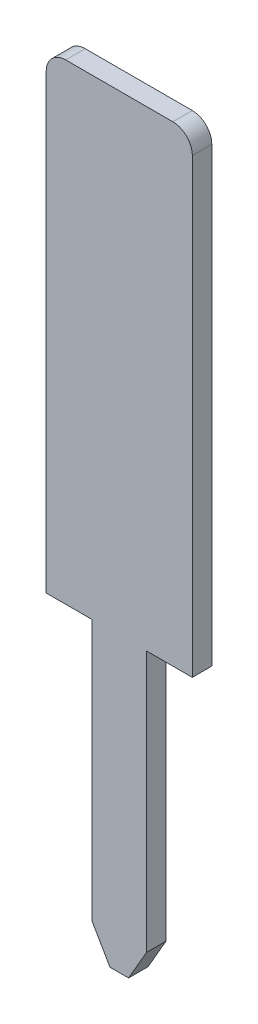
ISO-10303-21;
HEADER;
FILE_DESCRIPTION(('STEP AP214'),'2;1');
FILE_NAME('part.step','',(''),(''),'','','');
FILE_SCHEMA(('AUTOMOTIVE_DESIGN { 1 0 10303 214 1 1 1 1 }'));
ENDSEC;
DATA;
#1=APPLICATION_CONTEXT('core data for automotive mechanical design processes');
#2=APPLICATION_PROTOCOL_DEFINITION('international standard','automotive_design',2000,#1);
#3=PRODUCT_CONTEXT('',#1,'mechanical');
#4=PRODUCT('Part','Part','',(#3));
#5=PRODUCT_RELATED_PRODUCT_CATEGORY('part','',(#4));
#6=PRODUCT_DEFINITION_FORMATION('','',#4);
#7=PRODUCT_DEFINITION_CONTEXT('part definition',#1,'design');
#8=PRODUCT_DEFINITION('design','',#6,#7);
#9=PRODUCT_DEFINITION_SHAPE('','',#8);
#10=(LENGTH_UNIT() NAMED_UNIT(*) SI_UNIT(.MILLI.,.METRE.));
#11=(NAMED_UNIT(*) PLANE_ANGLE_UNIT() SI_UNIT($,.RADIAN.));
#12=(NAMED_UNIT(*) SI_UNIT($,.STERADIAN.) SOLID_ANGLE_UNIT());
#13=UNCERTAINTY_MEASURE_WITH_UNIT(LENGTH_MEASURE(1.E-05),#10,'distance_accuracy_value','');
#14=(GEOMETRIC_REPRESENTATION_CONTEXT(3) GLOBAL_UNCERTAINTY_ASSIGNED_CONTEXT((#13)) GLOBAL_UNIT_ASSIGNED_CONTEXT((#10,
#11,#12)) REPRESENTATION_CONTEXT('',''));
#15=CARTESIAN_POINT('',(0.,0.,0.));
#16=DIRECTION('',(0.,0.,1.));
#17=DIRECTION('',(1.,0.,0.));
#18=AXIS2_PLACEMENT_3D('',#15,#16,#17);
#19=CARTESIAN_POINT('',(-49.1053468890321,-48.13344814412,0.254));
#20=DIRECTION('',(1.,0.,0.));
#21=DIRECTION('',(0.,0.,-1.));
#22=AXIS2_PLACEMENT_3D('',#19,#20,#21);
#23=PLANE('',#22);
#24=DIRECTION('',(0.,-1.,0.));
#25=VECTOR('',#24,1.);
#26=CARTESIAN_POINT('',(-49.1053468890321,-48.13344814412,0.254));
#27=LINE('',#26,#25);
#28=CARTESIAN_POINT('',(-49.1053468890321,-48.38744814412,0.254));
#29=VERTEX_POINT('',#28);
#30=CARTESIAN_POINT('',(-49.1053468890321,-54.28024814412,0.254));
#31=VERTEX_POINT('',#30);
#32=EDGE_CURVE('E123',#29,#31,#27,.T.);
#33=ORIENTED_EDGE('',*,*,#32,.F.);
#34=DIRECTION('',(0.,0.,-1.));
#35=VECTOR('',#34,1.);
#36=CARTESIAN_POINT('',(-49.1053468890321,-48.38744814412,0.254));
#37=LINE('',#36,#35);
#38=CARTESIAN_POINT('',(-49.1053468890321,-48.38744814412,0.));
#39=VERTEX_POINT('',#38);
#40=EDGE_CURVE('E147',#29,#39,#37,.T.);
#41=ORIENTED_EDGE('',*,*,#40,.T.);
#42=DIRECTION('',(0.,-1.,0.));
#43=VECTOR('',#42,1.);
#44=CARTESIAN_POINT('',(-49.1053468890321,-48.13344814412,0.));
#45=LINE('',#44,#43);
#46=CARTESIAN_POINT('',(-49.1053468890321,-54.28024814412,0.));
#47=VERTEX_POINT('',#46);
#48=EDGE_CURVE('E145',#39,#47,#45,.T.);
#49=ORIENTED_EDGE('',*,*,#48,.T.);
#50=DIRECTION('',(0.,0.,-1.));
#51=VECTOR('',#50,1.);
#52=CARTESIAN_POINT('',(-49.1053468890321,-54.28024814412,0.254));
#53=LINE('',#52,#51);
#54=EDGE_CURVE('E138',#31,#47,#53,.T.);
#55=ORIENTED_EDGE('',*,*,#54,.F.);
#56=EDGE_LOOP('',(#33,#41,#49,#55));
#57=FACE_BOUND('',#56,.T.);
#58=ADVANCED_FACE('F33',(#57),#23,.F.);
#59=CARTESIAN_POINT('',(-48.5084468890321,-54.28024814412,0.254));
#60=DIRECTION('',(0.,1.,0.));
#61=DIRECTION('',(0.,0.,1.));
#62=AXIS2_PLACEMENT_3D('',#59,#60,#61);
#63=PLANE('',#62);
#64=DIRECTION('',(1.,0.,0.));
#65=VECTOR('',#64,1.);
#66=CARTESIAN_POINT('',(-48.5084468890321,-54.28024814412,0.));
#67=LINE('',#66,#65);
#68=CARTESIAN_POINT('',(-48.5084468890321,-54.28024814412,0.));
#69=VERTEX_POINT('',#68);
#70=EDGE_CURVE('E217',#47,#69,#67,.T.);
#71=ORIENTED_EDGE('',*,*,#70,.T.);
#72=DIRECTION('',(0.,0.,-1.));
#73=VECTOR('',#72,1.);
#74=CARTESIAN_POINT('',(-48.5084468890321,-54.28024814412,0.254));
#75=LINE('',#74,#73);
#76=CARTESIAN_POINT('',(-48.5084468890321,-54.28024814412,0.254));
#77=VERTEX_POINT('',#76);
#78=EDGE_CURVE('E140',#77,#69,#75,.T.);
#79=ORIENTED_EDGE('',*,*,#78,.F.);
#80=DIRECTION('',(1.,0.,0.));
#81=VECTOR('',#80,1.);
#82=CARTESIAN_POINT('',(-48.5084468890321,-54.28024814412,0.254));
#83=LINE('',#82,#81);
#84=EDGE_CURVE('E126',#31,#77,#83,.T.);
#85=ORIENTED_EDGE('',*,*,#84,.F.);
#86=ORIENTED_EDGE('',*,*,#54,.T.);
#87=EDGE_LOOP('',(#71,#79,#85,#86));
#88=FACE_BOUND('',#87,.T.);
#89=ADVANCED_FACE('F137',(#88),#63,.F.);
#90=CARTESIAN_POINT('',(-48.5084468890321,-54.28024814412,0.254));
#91=DIRECTION('',(1.,0.,0.));
#92=DIRECTION('',(0.,0.,-1.));
#93=AXIS2_PLACEMENT_3D('',#90,#91,#92);
#94=PLANE('',#93);
#95=DIRECTION('',(0.,-1.,0.));
#96=VECTOR('',#95,1.);
#97=CARTESIAN_POINT('',(-48.5084468890321,-54.28024814412,0.));
#98=LINE('',#97,#96);
#99=CARTESIAN_POINT('',(-48.5084468890321,-57.6841938267253,0.));
#100=VERTEX_POINT('',#99);
#101=EDGE_CURVE('E211',#69,#100,#98,.T.);
#102=ORIENTED_EDGE('',*,*,#101,.T.);
#103=DIRECTION('',(0.,0.,-1.));
#104=VECTOR('',#103,1.);
#105=CARTESIAN_POINT('',(-48.5084468890321,-57.6841938267253,0.254));
#106=LINE('',#105,#104);
#107=CARTESIAN_POINT('',(-48.5084468890321,-57.6841938267253,0.254));
#108=VERTEX_POINT('',#107);
#109=EDGE_CURVE('E151',#108,#100,#106,.T.);
#110=ORIENTED_EDGE('',*,*,#109,.F.);
#111=DIRECTION('',(0.,-1.,0.));
#112=VECTOR('',#111,1.);
#113=CARTESIAN_POINT('',(-48.5084468890321,-54.28024814412,0.254));
#114=LINE('',#113,#112);
#115=EDGE_CURVE('E142',#77,#108,#114,.T.);
#116=ORIENTED_EDGE('',*,*,#115,.F.);
#117=ORIENTED_EDGE('',*,*,#78,.T.);
#118=EDGE_LOOP('',(#102,#110,#116,#117));
#119=FACE_BOUND('',#118,.T.);
#120=ADVANCED_FACE('F238',(#119),#94,.F.);
#121=CARTESIAN_POINT('',(-48.5084468890321,-57.6841938267253,0.254));
#122=DIRECTION('',(0.866025403784436,0.500000000000004,0.));
#123=DIRECTION('',(-0.500000000000004,0.866025403784436,0.));
#124=AXIS2_PLACEMENT_3D('',#121,#122,#123);
#125=PLANE('',#124);
#126=DIRECTION('',(0.500000000000004,-0.866025403784436,0.));
#127=VECTOR('',#126,1.);
#128=CARTESIAN_POINT('',(-48.5084468890321,-57.6841938267253,0.));
#129=LINE('',#128,#127);
#130=CARTESIAN_POINT('',(-48.2740113195786,-58.09024814412,0.));
#131=VERTEX_POINT('',#130);
#132=EDGE_CURVE('E206',#100,#131,#129,.T.);
#133=ORIENTED_EDGE('',*,*,#132,.T.);
#134=DIRECTION('',(0.,0.,-1.));
#135=VECTOR('',#134,1.);
#136=CARTESIAN_POINT('',(-48.2740113195786,-58.09024814412,0.254));
#137=LINE('',#136,#135);
#138=CARTESIAN_POINT('',(-48.2740113195786,-58.09024814412,0.254));
#139=VERTEX_POINT('',#138);
#140=EDGE_CURVE('E197',#139,#131,#137,.T.);
#141=ORIENTED_EDGE('',*,*,#140,.F.);
#142=DIRECTION('',(0.500000000000004,-0.866025403784436,0.));
#143=VECTOR('',#142,1.);
#144=CARTESIAN_POINT('',(-48.5084468890321,-57.6841938267253,0.254));
#145=LINE('',#144,#143);
#146=EDGE_CURVE('E207',#108,#139,#145,.T.);
#147=ORIENTED_EDGE('',*,*,#146,.F.);
#148=ORIENTED_EDGE('',*,*,#109,.T.);
#149=EDGE_LOOP('',(#133,#141,#147,#148));
#150=FACE_BOUND('',#149,.T.);
#151=ADVANCED_FACE('F204',(#150),#125,.F.);
#152=CARTESIAN_POINT('',(-48.2740113195786,-58.09024814412,0.254));
#153=DIRECTION('',(0.,1.,0.));
#154=DIRECTION('',(0.,0.,1.));
#155=AXIS2_PLACEMENT_3D('',#152,#153,#154);
#156=PLANE('',#155);
#157=DIRECTION('',(1.,0.,0.));
#158=VECTOR('',#157,1.);
#159=CARTESIAN_POINT('',(-48.2740113195786,-58.09024814412,0.));
#160=LINE('',#159,#158);
#161=CARTESIAN_POINT('',(-48.0316824584855,-58.09024814412,0.));
#162=VERTEX_POINT('',#161);
#163=EDGE_CURVE('E213',#131,#162,#160,.T.);
#164=ORIENTED_EDGE('',*,*,#163,.T.);
#165=DIRECTION('',(0.,0.,-1.));
#166=VECTOR('',#165,1.);
#167=CARTESIAN_POINT('',(-48.0316824584855,-58.09024814412,0.254));
#168=LINE('',#167,#166);
#169=CARTESIAN_POINT('',(-48.0316824584855,-58.09024814412,0.254));
#170=VERTEX_POINT('',#169);
#171=EDGE_CURVE('E194',#170,#162,#168,.T.);
#172=ORIENTED_EDGE('',*,*,#171,.F.);
#173=DIRECTION('',(1.,0.,0.));
#174=VECTOR('',#173,1.);
#175=CARTESIAN_POINT('',(-48.2740113195786,-58.09024814412,0.254));
#176=LINE('',#175,#174);
#177=EDGE_CURVE('E240',#139,#170,#176,.T.);
#178=ORIENTED_EDGE('',*,*,#177,.F.);
#179=ORIENTED_EDGE('',*,*,#140,.T.);
#180=EDGE_LOOP('',(#164,#172,#178,#179));
#181=FACE_BOUND('',#180,.T.);
#182=ADVANCED_FACE('F249',(#181),#156,.F.);
#183=CARTESIAN_POINT('',(-47.7972468890321,-57.6841938267253,0.254));
#184=DIRECTION('',(-0.86602540378443,0.500000000000015,0.));
#185=DIRECTION('',(-0.500000000000015,-0.86602540378443,0.));
#186=AXIS2_PLACEMENT_3D('',#183,#184,#185);
#187=PLANE('',#186);
#188=DIRECTION('',(0.500000000000015,0.86602540378443,0.));
#189=VECTOR('',#188,1.);
#190=CARTESIAN_POINT('',(-47.7972468890321,-57.6841938267253,0.));
#191=LINE('',#190,#189);
#192=CARTESIAN_POINT('',(-47.7972468890321,-57.6841938267253,0.));
#193=VERTEX_POINT('',#192);
#194=EDGE_CURVE('E215',#162,#193,#191,.T.);
#195=ORIENTED_EDGE('',*,*,#194,.T.);
#196=DIRECTION('',(0.,0.,-1.));
#197=VECTOR('',#196,1.);
#198=CARTESIAN_POINT('',(-47.7972468890321,-57.6841938267253,0.254));
#199=LINE('',#198,#197);
#200=CARTESIAN_POINT('',(-47.7972468890321,-57.6841938267253,0.254));
#201=VERTEX_POINT('',#200);
#202=EDGE_CURVE('E191',#201,#193,#199,.T.);
#203=ORIENTED_EDGE('',*,*,#202,.F.);
#204=DIRECTION('',(0.500000000000015,0.86602540378443,0.));
#205=VECTOR('',#204,1.);
#206=CARTESIAN_POINT('',(-47.7972468890321,-57.6841938267253,0.254));
#207=LINE('',#206,#205);
#208=EDGE_CURVE('E234',#170,#201,#207,.T.);
#209=ORIENTED_EDGE('',*,*,#208,.F.);
#210=ORIENTED_EDGE('',*,*,#171,.T.);
#211=EDGE_LOOP('',(#195,#203,#209,#210));
#212=FACE_BOUND('',#211,.T.);
#213=ADVANCED_FACE('F247',(#212),#187,.F.);
#214=CARTESIAN_POINT('',(-47.7972468890321,-54.28024814412,0.254));
#215=DIRECTION('',(-1.,0.,0.));
#216=DIRECTION('',(0.,-1.,0.));
#217=AXIS2_PLACEMENT_3D('',#214,#215,#216);
#218=PLANE('',#217);
#219=DIRECTION('',(0.,1.,0.));
#220=VECTOR('',#219,1.);
#221=CARTESIAN_POINT('',(-47.7972468890321,-54.28024814412,0.));
#222=LINE('',#221,#220);
#223=CARTESIAN_POINT('',(-47.7972468890321,-54.28024814412,0.));
#224=VERTEX_POINT('',#223);
#225=EDGE_CURVE('E183',#193,#224,#222,.T.);
#226=ORIENTED_EDGE('',*,*,#225,.T.);
#227=DIRECTION('',(0.,0.,-1.));
#228=VECTOR('',#227,1.);
#229=CARTESIAN_POINT('',(-47.7972468890321,-54.28024814412,0.254));
#230=LINE('',#229,#228);
#231=CARTESIAN_POINT('',(-47.7972468890321,-54.28024814412,0.254));
#232=VERTEX_POINT('',#231);
#233=EDGE_CURVE('E188',#232,#224,#230,.T.);
#234=ORIENTED_EDGE('',*,*,#233,.F.);
#235=DIRECTION('',(0.,1.,0.));
#236=VECTOR('',#235,1.);
#237=CARTESIAN_POINT('',(-47.7972468890321,-54.28024814412,0.254));
#238=LINE('',#237,#236);
#239=EDGE_CURVE('E231',#201,#232,#238,.T.);
#240=ORIENTED_EDGE('',*,*,#239,.F.);
#241=ORIENTED_EDGE('',*,*,#202,.T.);
#242=EDGE_LOOP('',(#226,#234,#240,#241));
#243=FACE_BOUND('',#242,.T.);
#244=ADVANCED_FACE('F224',(#243),#218,.F.);
#245=CARTESIAN_POINT('',(-47.7972468890321,-54.28024814412,0.254));
#246=DIRECTION('',(0.,1.,0.));
#247=DIRECTION('',(0.,0.,1.));
#248=AXIS2_PLACEMENT_3D('',#245,#246,#247);
#249=PLANE('',#248);
#250=DIRECTION('',(1.,0.,0.));
#251=VECTOR('',#250,1.);
#252=CARTESIAN_POINT('',(-47.7972468890321,-54.28024814412,0.));
#253=LINE('',#252,#251);
#254=CARTESIAN_POINT('',(-47.2003468890321,-54.28024814412,0.));
#255=VERTEX_POINT('',#254);
#256=EDGE_CURVE('E180',#224,#255,#253,.T.);
#257=ORIENTED_EDGE('',*,*,#256,.T.);
#258=DIRECTION('',(0.,0.,-1.));
#259=VECTOR('',#258,1.);
#260=CARTESIAN_POINT('',(-47.2003468890321,-54.28024814412,0.254));
#261=LINE('',#260,#259);
#262=CARTESIAN_POINT('',(-47.2003468890321,-54.28024814412,0.254));
#263=VERTEX_POINT('',#262);
#264=EDGE_CURVE('E170',#263,#255,#261,.T.);
#265=ORIENTED_EDGE('',*,*,#264,.F.);
#266=DIRECTION('',(1.,0.,0.));
#267=VECTOR('',#266,1.);
#268=CARTESIAN_POINT('',(-47.7972468890321,-54.28024814412,0.254));
#269=LINE('',#268,#267);
#270=EDGE_CURVE('E230',#232,#263,#269,.T.);
#271=ORIENTED_EDGE('',*,*,#270,.F.);
#272=ORIENTED_EDGE('',*,*,#233,.T.);
#273=EDGE_LOOP('',(#257,#265,#271,#272));
#274=FACE_BOUND('',#273,.T.);
#275=ADVANCED_FACE('F229',(#274),#249,.F.);
#276=CARTESIAN_POINT('',(-47.2003468890321,-54.28024814412,0.254));
#277=DIRECTION('',(-1.,0.,0.));
#278=DIRECTION('',(0.,-1.,0.));
#279=AXIS2_PLACEMENT_3D('',#276,#277,#278);
#280=PLANE('',#279);
#281=DIRECTION('',(0.,1.,0.));
#282=VECTOR('',#281,1.);
#283=CARTESIAN_POINT('',(-47.2003468890321,-54.28024814412,0.));
#284=LINE('',#283,#282);
#285=CARTESIAN_POINT('',(-47.2003468890321,-48.38744814412,0.));
#286=VERTEX_POINT('',#285);
#287=EDGE_CURVE('E176',#255,#286,#284,.T.);
#288=ORIENTED_EDGE('',*,*,#287,.T.);
#289=DIRECTION('',(0.,0.,-1.));
#290=VECTOR('',#289,1.);
#291=CARTESIAN_POINT('',(-47.2003468890321,-48.38744814412,0.254));
#292=LINE('',#291,#290);
#293=CARTESIAN_POINT('',(-47.2003468890321,-48.38744814412,0.254));
#294=VERTEX_POINT('',#293);
#295=EDGE_CURVE('E11',#286,#294,#292,.F.);
#296=ORIENTED_EDGE('',*,*,#295,.T.);
#297=DIRECTION('',(0.,1.,0.));
#298=VECTOR('',#297,1.);
#299=CARTESIAN_POINT('',(-47.2003468890321,-54.28024814412,0.254));
#300=LINE('',#299,#298);
#301=EDGE_CURVE('E165',#263,#294,#300,.T.);
#302=ORIENTED_EDGE('',*,*,#301,.F.);
#303=ORIENTED_EDGE('',*,*,#264,.T.);
#304=EDGE_LOOP('',(#288,#296,#302,#303));
#305=FACE_BOUND('',#304,.T.);
#306=ADVANCED_FACE('F178',(#305),#280,.F.);
#307=CARTESIAN_POINT('',(-49.1053468890321,-48.13344814412,0.254));
#308=DIRECTION('',(0.,-1.,0.));
#309=DIRECTION('',(0.,0.,-1.));
#310=AXIS2_PLACEMENT_3D('',#307,#308,#309);
#311=PLANE('',#310);
#312=DIRECTION('',(-1.,0.,0.));
#313=VECTOR('',#312,1.);
#314=CARTESIAN_POINT('',(-49.1053468890321,-48.13344814412,0.));
#315=LINE('',#314,#313);
#316=CARTESIAN_POINT('',(-47.4543468890321,-48.13344814412,0.));
#317=VERTEX_POINT('',#316);
#318=CARTESIAN_POINT('',(-48.8513468890321,-48.13344814412,0.));
#319=VERTEX_POINT('',#318);
#320=EDGE_CURVE('E133',#317,#319,#315,.T.);
#321=ORIENTED_EDGE('',*,*,#320,.T.);
#322=DIRECTION('',(0.,0.,-1.));
#323=VECTOR('',#322,1.);
#324=CARTESIAN_POINT('',(-48.8513468890321,-48.13344814412,0.254));
#325=LINE('',#324,#323);
#326=CARTESIAN_POINT('',(-48.8513468890321,-48.13344814412,0.254));
#327=VERTEX_POINT('',#326);
#328=EDGE_CURVE('E54',#319,#327,#325,.F.);
#329=ORIENTED_EDGE('',*,*,#328,.T.);
#330=DIRECTION('',(-1.,0.,0.));
#331=VECTOR('',#330,1.);
#332=CARTESIAN_POINT('',(-49.1053468890321,-48.13344814412,0.254));
#333=LINE('',#332,#331);
#334=CARTESIAN_POINT('',(-47.4543468890321,-48.13344814412,0.254));
#335=VERTEX_POINT('',#334);
#336=EDGE_CURVE('E164',#335,#327,#333,.T.);
#337=ORIENTED_EDGE('',*,*,#336,.F.);
#338=DIRECTION('',(0.,0.,-1.));
#339=VECTOR('',#338,1.);
#340=CARTESIAN_POINT('',(-47.4543468890321,-48.13344814412,0.254));
#341=LINE('',#340,#339);
#342=EDGE_CURVE('E158',#335,#317,#341,.T.);
#343=ORIENTED_EDGE('',*,*,#342,.T.);
#344=EDGE_LOOP('',(#321,#329,#337,#343));
#345=FACE_BOUND('',#344,.T.);
#346=ADVANCED_FACE('F168',(#345),#311,.F.);
#347=CARTESIAN_POINT('',(0.,0.,0.254));
#348=DIRECTION('',(0.,0.,-1.));
#349=DIRECTION('',(-1.,0.,0.));
#350=AXIS2_PLACEMENT_3D('',#347,#348,#349);
#351=PLANE('',#350);
#352=ORIENTED_EDGE('',*,*,#336,.T.);
#353=CARTESIAN_POINT('',(-48.8513468890321,-48.38744814412,0.254));
#354=DIRECTION('',(0.,0.,-1.));
#355=DIRECTION('',(-1.,0.,0.));
#356=AXIS2_PLACEMENT_3D('',#353,#354,#355);
#357=CIRCLE('',#356,0.254);
#358=EDGE_CURVE('E41',#327,#29,#357,.F.);
#359=ORIENTED_EDGE('',*,*,#358,.T.);
#360=ORIENTED_EDGE('',*,*,#32,.T.);
#361=ORIENTED_EDGE('',*,*,#84,.T.);
#362=ORIENTED_EDGE('',*,*,#115,.T.);
#363=ORIENTED_EDGE('',*,*,#146,.T.);
#364=ORIENTED_EDGE('',*,*,#177,.T.);
#365=ORIENTED_EDGE('',*,*,#208,.T.);
#366=ORIENTED_EDGE('',*,*,#239,.T.);
#367=ORIENTED_EDGE('',*,*,#270,.T.);
#368=ORIENTED_EDGE('',*,*,#301,.T.);
#369=CARTESIAN_POINT('',(-47.4543468890321,-48.38744814412,0.254));
#370=DIRECTION('',(0.,0.,-1.));
#371=DIRECTION('',(-1.,0.,0.));
#372=AXIS2_PLACEMENT_3D('',#369,#370,#371);
#373=CIRCLE('',#372,0.254);
#374=EDGE_CURVE('E162',#294,#335,#373,.F.);
#375=ORIENTED_EDGE('',*,*,#374,.T.);
#376=EDGE_LOOP('',(#352,#359,#360,#361,#362,#363,#364,#365,#366,#367,#368,#375));
#377=FACE_BOUND('',#376,.T.);
#378=ADVANCED_FACE('F125',(#377),#351,.F.);
#379=CARTESIAN_POINT('',(0.,0.,0.));
#380=DIRECTION('',(0.,0.,-1.));
#381=DIRECTION('',(-1.,0.,0.));
#382=AXIS2_PLACEMENT_3D('',#379,#380,#381);
#383=PLANE('',#382);
#384=ORIENTED_EDGE('',*,*,#48,.F.);
#385=CARTESIAN_POINT('',(-48.8513468890321,-48.38744814412,0.));
#386=DIRECTION('',(0.,0.,-1.));
#387=DIRECTION('',(-1.,0.,0.));
#388=AXIS2_PLACEMENT_3D('',#385,#386,#387);
#389=CIRCLE('',#388,0.254);
#390=EDGE_CURVE('E156',#39,#319,#389,.T.);
#391=ORIENTED_EDGE('',*,*,#390,.T.);
#392=ORIENTED_EDGE('',*,*,#320,.F.);
#393=CARTESIAN_POINT('',(-47.4543468890321,-48.38744814412,0.));
#394=DIRECTION('',(0.,0.,-1.));
#395=DIRECTION('',(-1.,0.,0.));
#396=AXIS2_PLACEMENT_3D('',#393,#394,#395);
#397=CIRCLE('',#396,0.254);
#398=EDGE_CURVE('E149',#317,#286,#397,.T.);
#399=ORIENTED_EDGE('',*,*,#398,.T.);
#400=ORIENTED_EDGE('',*,*,#287,.F.);
#401=ORIENTED_EDGE('',*,*,#256,.F.);
#402=ORIENTED_EDGE('',*,*,#225,.F.);
#403=ORIENTED_EDGE('',*,*,#194,.F.);
#404=ORIENTED_EDGE('',*,*,#163,.F.);
#405=ORIENTED_EDGE('',*,*,#132,.F.);
#406=ORIENTED_EDGE('',*,*,#101,.F.);
#407=ORIENTED_EDGE('',*,*,#70,.F.);
#408=EDGE_LOOP('',(#384,#391,#392,#399,#400,#401,#402,#403,#404,#405,#406,#407));
#409=FACE_BOUND('',#408,.T.);
#410=ADVANCED_FACE('F174',(#409),#383,.T.);
#411=CARTESIAN_POINT('',(-48.8513468890321,-48.38744814412,0.254));
#412=DIRECTION('',(0.,0.,-1.));
#413=DIRECTION('',(-1.,0.,0.));
#414=AXIS2_PLACEMENT_3D('',#411,#412,#413);
#415=CYLINDRICAL_SURFACE('',#414,0.254);
#416=ORIENTED_EDGE('',*,*,#358,.F.);
#417=ORIENTED_EDGE('',*,*,#328,.F.);
#418=ORIENTED_EDGE('',*,*,#390,.F.);
#419=ORIENTED_EDGE('',*,*,#40,.F.);
#420=EDGE_LOOP('',(#416,#417,#418,#419));
#421=FACE_BOUND('',#420,.T.);
#422=ADVANCED_FACE('F265',(#421),#415,.T.);
#423=CARTESIAN_POINT('',(-47.4543468890321,-48.38744814412,0.254));
#424=DIRECTION('',(0.,0.,-1.));
#425=DIRECTION('',(-1.,0.,0.));
#426=AXIS2_PLACEMENT_3D('',#423,#424,#425);
#427=CYLINDRICAL_SURFACE('',#426,0.254);
#428=ORIENTED_EDGE('',*,*,#374,.F.);
#429=ORIENTED_EDGE('',*,*,#295,.F.);
#430=ORIENTED_EDGE('',*,*,#398,.F.);
#431=ORIENTED_EDGE('',*,*,#342,.F.);
#432=EDGE_LOOP('',(#428,#429,#430,#431));
#433=FACE_BOUND('',#432,.T.);
#434=ADVANCED_FACE('F35',(#433),#427,.T.);
#435=CLOSED_SHELL('',(#58,#89,#120,#151,#182,#213,#244,#275,#306,#346,#378,#410,#422,#434));
#436=MANIFOLD_SOLID_BREP('B2',#435);
#437=ADVANCED_BREP_SHAPE_REPRESENTATION('',(#18,#436),#14);
#438=SHAPE_DEFINITION_REPRESENTATION(#9,#437);
ENDSEC;
END-ISO-10303-21;
